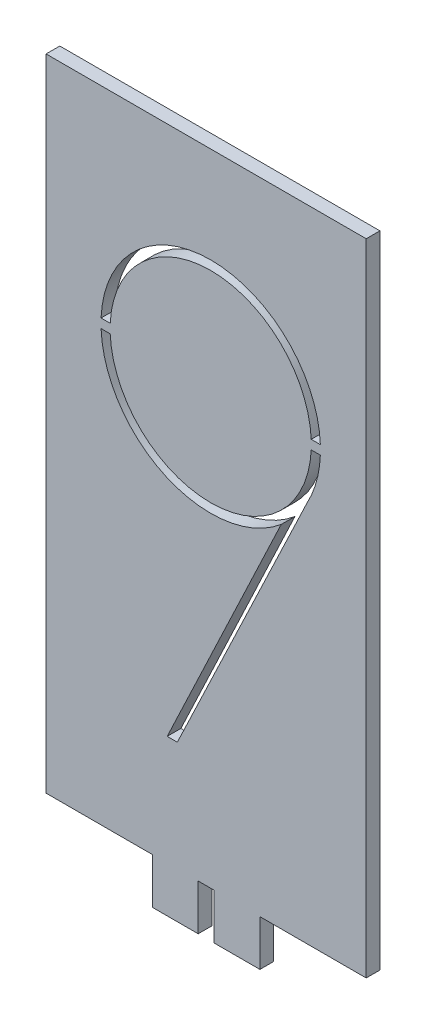
ISO-10303-21;
HEADER;
FILE_DESCRIPTION(('STEP AP214'),'2;1');
FILE_NAME('part.step','',(''),(''),'','','');
FILE_SCHEMA(('AUTOMOTIVE_DESIGN { 1 0 10303 214 1 1 1 1 }'));
ENDSEC;
DATA;
#1=APPLICATION_CONTEXT('core data for automotive mechanical design processes');
#2=APPLICATION_PROTOCOL_DEFINITION('international standard','automotive_design',2000,#1);
#3=PRODUCT_CONTEXT('',#1,'mechanical');
#4=PRODUCT('Part','Part','',(#3));
#5=PRODUCT_RELATED_PRODUCT_CATEGORY('part','',(#4));
#6=PRODUCT_DEFINITION_FORMATION('','',#4);
#7=PRODUCT_DEFINITION_CONTEXT('part definition',#1,'design');
#8=PRODUCT_DEFINITION('design','',#6,#7);
#9=PRODUCT_DEFINITION_SHAPE('','',#8);
#10=(LENGTH_UNIT() NAMED_UNIT(*) SI_UNIT(.MILLI.,.METRE.));
#11=(NAMED_UNIT(*) PLANE_ANGLE_UNIT() SI_UNIT($,.RADIAN.));
#12=(NAMED_UNIT(*) SI_UNIT($,.STERADIAN.) SOLID_ANGLE_UNIT());
#13=UNCERTAINTY_MEASURE_WITH_UNIT(LENGTH_MEASURE(1.E-05),#10,'distance_accuracy_value','');
#14=(GEOMETRIC_REPRESENTATION_CONTEXT(3) GLOBAL_UNCERTAINTY_ASSIGNED_CONTEXT((#13)) GLOBAL_UNIT_ASSIGNED_CONTEXT((#10,
#11,#12)) REPRESENTATION_CONTEXT('',''));
#15=CARTESIAN_POINT('',(0.,0.,0.));
#16=DIRECTION('',(0.,0.,1.));
#17=DIRECTION('',(1.,0.,0.));
#18=AXIS2_PLACEMENT_3D('',#15,#16,#17);
#19=CARTESIAN_POINT('',(18.,52.5,-18.5));
#20=DIRECTION('',(0.,0.,1.));
#21=DIRECTION('',(1.,0.,0.));
#22=AXIS2_PLACEMENT_3D('',#19,#20,#21);
#23=CYLINDRICAL_SURFACE('',#22,12.);
#24=CARTESIAN_POINT('',(18.,52.5,1.5));
#25=DIRECTION('',(0.,0.,1.));
#26=DIRECTION('',(1.,0.,0.));
#27=AXIS2_PLACEMENT_3D('',#24,#25,#26);
#28=CIRCLE('',#27,12.);
#29=CARTESIAN_POINT('',(6.01042119171821,52.,1.5));
#30=VERTEX_POINT('',#29);
#31=CARTESIAN_POINT('',(25.707199855607,43.3022247045423,1.5));
#32=VERTEX_POINT('',#31);
#33=EDGE_CURVE('E403',#30,#32,#28,.T.);
#34=ORIENTED_EDGE('',*,*,#33,.T.);
#35=DIRECTION('',(0.,0.,1.));
#36=VECTOR('',#35,1.);
#37=CARTESIAN_POINT('',(25.707199855607,43.3022247045423,-18.5));
#38=LINE('',#37,#36);
#39=CARTESIAN_POINT('',(25.707199855607,43.3022247045423,0.));
#40=VERTEX_POINT('',#39);
#41=EDGE_CURVE('E215',#32,#40,#38,.F.);
#42=ORIENTED_EDGE('',*,*,#41,.T.);
#43=CARTESIAN_POINT('',(18.,52.5,0.));
#44=DIRECTION('',(0.,0.,-1.));
#45=DIRECTION('',(-1.,0.,0.));
#46=AXIS2_PLACEMENT_3D('',#43,#44,#45);
#47=CIRCLE('',#46,12.);
#48=CARTESIAN_POINT('',(6.01042119171821,52.,0.));
#49=VERTEX_POINT('',#48);
#50=EDGE_CURVE('E274',#40,#49,#47,.T.);
#51=ORIENTED_EDGE('',*,*,#50,.T.);
#52=DIRECTION('',(0.,0.,1.));
#53=VECTOR('',#52,1.);
#54=CARTESIAN_POINT('',(6.01042119171821,52.,-18.5));
#55=LINE('',#54,#53);
#56=EDGE_CURVE('E402',#49,#30,#55,.T.);
#57=ORIENTED_EDGE('',*,*,#56,.T.);
#58=EDGE_LOOP('',(#34,#42,#51,#57));
#59=FACE_BOUND('',#58,.T.);
#60=ADVANCED_FACE('F39',(#59),#23,.F.);
#61=CARTESIAN_POINT('',(4.78723054685726,53.,0.));
#62=DIRECTION('',(0.,1.,0.));
#63=DIRECTION('',(-1.,0.,0.));
#64=AXIS2_PLACEMENT_3D('',#61,#62,#63);
#65=PLANE('',#64);
#66=DIRECTION('',(0.,0.,1.));
#67=VECTOR('',#66,1.);
#68=CARTESIAN_POINT('',(7.01136951208205,53.,-18.5));
#69=LINE('',#68,#67);
#70=CARTESIAN_POINT('',(7.01136951208205,53.,0.));
#71=VERTEX_POINT('',#70);
#72=CARTESIAN_POINT('',(7.01136951208205,53.,1.5));
#73=VERTEX_POINT('',#72);
#74=EDGE_CURVE('E246',#71,#73,#69,.T.);
#75=ORIENTED_EDGE('',*,*,#74,.F.);
#76=DIRECTION('',(-1.,0.,0.));
#77=VECTOR('',#76,1.);
#78=CARTESIAN_POINT('',(4.78723054685726,53.,0.));
#79=LINE('',#78,#77);
#80=CARTESIAN_POINT('',(6.01042119171821,53.,0.));
#81=VERTEX_POINT('',#80);
#82=EDGE_CURVE('E254',#71,#81,#79,.T.);
#83=ORIENTED_EDGE('',*,*,#82,.T.);
#84=DIRECTION('',(0.,0.,1.));
#85=VECTOR('',#84,1.);
#86=CARTESIAN_POINT('',(6.01042119171821,53.,-18.5));
#87=LINE('',#86,#85);
#88=CARTESIAN_POINT('',(6.01042119171821,53.,1.5));
#89=VERTEX_POINT('',#88);
#90=EDGE_CURVE('E415',#89,#81,#87,.F.);
#91=ORIENTED_EDGE('',*,*,#90,.F.);
#92=DIRECTION('',(-1.,0.,0.));
#93=VECTOR('',#92,1.);
#94=CARTESIAN_POINT('',(4.78723054685726,53.,1.5));
#95=LINE('',#94,#93);
#96=EDGE_CURVE('E265',#73,#89,#95,.T.);
#97=ORIENTED_EDGE('',*,*,#96,.F.);
#98=EDGE_LOOP('',(#75,#83,#91,#97));
#99=FACE_BOUND('',#98,.T.);
#100=ADVANCED_FACE('F470',(#99),#65,.T.);
#101=CARTESIAN_POINT('',(4.78723054685726,52.,0.));
#102=DIRECTION('',(0.,-1.,0.));
#103=DIRECTION('',(0.,0.,-1.));
#104=AXIS2_PLACEMENT_3D('',#101,#102,#103);
#105=PLANE('',#104);
#106=DIRECTION('',(0.,0.,1.));
#107=VECTOR('',#106,1.);
#108=CARTESIAN_POINT('',(28.988630487918,52.,-18.5));
#109=LINE('',#108,#107);
#110=CARTESIAN_POINT('',(28.988630487918,52.,0.));
#111=VERTEX_POINT('',#110);
#112=CARTESIAN_POINT('',(28.988630487918,52.,1.5));
#113=VERTEX_POINT('',#112);
#114=EDGE_CURVE('E423',#111,#113,#109,.T.);
#115=ORIENTED_EDGE('',*,*,#114,.F.);
#116=DIRECTION('',(1.,0.,0.));
#117=VECTOR('',#116,1.);
#118=CARTESIAN_POINT('',(4.78723054685726,52.,0.));
#119=LINE('',#118,#117);
#120=CARTESIAN_POINT('',(29.9895788082818,52.,0.));
#121=VERTEX_POINT('',#120);
#122=EDGE_CURVE('E255',#111,#121,#119,.T.);
#123=ORIENTED_EDGE('',*,*,#122,.T.);
#124=DIRECTION('',(0.,0.,1.));
#125=VECTOR('',#124,1.);
#126=CARTESIAN_POINT('',(29.9895788082818,52.,-18.5));
#127=LINE('',#126,#125);
#128=CARTESIAN_POINT('',(29.9895788082818,52.,1.5));
#129=VERTEX_POINT('',#128);
#130=EDGE_CURVE('E407',#129,#121,#127,.F.);
#131=ORIENTED_EDGE('',*,*,#130,.F.);
#132=DIRECTION('',(1.,0.,0.));
#133=VECTOR('',#132,1.);
#134=CARTESIAN_POINT('',(4.78723054685726,52.,1.5));
#135=LINE('',#134,#133);
#136=EDGE_CURVE('E249',#113,#129,#135,.T.);
#137=ORIENTED_EDGE('',*,*,#136,.F.);
#138=EDGE_LOOP('',(#115,#123,#131,#137));
#139=FACE_BOUND('',#138,.T.);
#140=ADVANCED_FACE('F467',(#139),#105,.T.);
#141=CARTESIAN_POINT('',(29.9895788082818,53.,1.5));
#142=VERTEX_POINT('',#141);
#143=EDGE_CURVE('E398',#142,#89,#28,.T.);
#144=ORIENTED_EDGE('',*,*,#143,.T.);
#145=ORIENTED_EDGE('',*,*,#90,.T.);
#146=CARTESIAN_POINT('',(29.9895788082818,53.,0.));
#147=VERTEX_POINT('',#146);
#148=EDGE_CURVE('E269',#81,#147,#47,.T.);
#149=ORIENTED_EDGE('',*,*,#148,.T.);
#150=DIRECTION('',(0.,0.,1.));
#151=VECTOR('',#150,1.);
#152=CARTESIAN_POINT('',(29.9895788082818,53.,-18.5));
#153=LINE('',#152,#151);
#154=EDGE_CURVE('E411',#147,#142,#153,.T.);
#155=ORIENTED_EDGE('',*,*,#154,.T.);
#156=EDGE_LOOP('',(#144,#145,#149,#155));
#157=FACE_BOUND('',#156,.T.);
#158=ADVANCED_FACE('F469',(#157),#23,.F.);
#159=CARTESIAN_POINT('',(0.,0.,1.5));
#160=DIRECTION('',(0.,1.,0.));
#161=DIRECTION('',(0.,0.,1.));
#162=AXIS2_PLACEMENT_3D('',#159,#160,#161);
#163=PLANE('',#162);
#164=DIRECTION('',(1.,0.,0.));
#165=VECTOR('',#164,1.);
#166=CARTESIAN_POINT('',(0.,0.,1.5));
#167=LINE('',#166,#165);
#168=CARTESIAN_POINT('',(11.63,0.,1.5));
#169=VERTEX_POINT('',#168);
#170=CARTESIAN_POINT('',(16.63,0.,1.5));
#171=VERTEX_POINT('',#170);
#172=EDGE_CURVE('E312',#169,#171,#167,.T.);
#173=ORIENTED_EDGE('',*,*,#172,.F.);
#174=DIRECTION('',(0.,0.,1.));
#175=VECTOR('',#174,1.);
#176=CARTESIAN_POINT('',(11.63,0.,0.));
#177=LINE('',#176,#175);
#178=CARTESIAN_POINT('',(11.63,0.,0.));
#179=VERTEX_POINT('',#178);
#180=EDGE_CURVE('E377',#179,#169,#177,.T.);
#181=ORIENTED_EDGE('',*,*,#180,.F.);
#182=DIRECTION('',(1.,0.,0.));
#183=VECTOR('',#182,1.);
#184=CARTESIAN_POINT('',(0.,0.,0.));
#185=LINE('',#184,#183);
#186=CARTESIAN_POINT('',(16.63,0.,0.));
#187=VERTEX_POINT('',#186);
#188=EDGE_CURVE('E260',#179,#187,#185,.T.);
#189=ORIENTED_EDGE('',*,*,#188,.T.);
#190=DIRECTION('',(0.,0.,1.));
#191=VECTOR('',#190,1.);
#192=CARTESIAN_POINT('',(16.63,0.,0.));
#193=LINE('',#192,#191);
#194=EDGE_CURVE('E300',#187,#171,#193,.T.);
#195=ORIENTED_EDGE('',*,*,#194,.T.);
#196=EDGE_LOOP('',(#173,#181,#189,#195));
#197=FACE_BOUND('',#196,.T.);
#198=ADVANCED_FACE('F476',(#197),#163,.F.);
#199=CARTESIAN_POINT('',(0.,0.,1.5));
#200=DIRECTION('',(1.,0.,0.));
#201=DIRECTION('',(0.,1.,0.));
#202=AXIS2_PLACEMENT_3D('',#199,#200,#201);
#203=PLANE('',#202);
#204=DIRECTION('',(0.,-1.,0.));
#205=VECTOR('',#204,1.);
#206=CARTESIAN_POINT('',(0.,0.,0.));
#207=LINE('',#206,#205);
#208=CARTESIAN_POINT('',(0.,75.,0.));
#209=VERTEX_POINT('',#208);
#210=CARTESIAN_POINT('',(0.,5.,0.));
#211=VERTEX_POINT('',#210);
#212=EDGE_CURVE('E296',#209,#211,#207,.T.);
#213=ORIENTED_EDGE('',*,*,#212,.T.);
#214=DIRECTION('',(0.,0.,1.));
#215=VECTOR('',#214,1.);
#216=CARTESIAN_POINT('',(0.,5.,0.));
#217=LINE('',#216,#215);
#218=CARTESIAN_POINT('',(0.,5.,1.5));
#219=VERTEX_POINT('',#218);
#220=EDGE_CURVE('E286',#211,#219,#217,.T.);
#221=ORIENTED_EDGE('',*,*,#220,.T.);
#222=DIRECTION('',(0.,-1.,0.));
#223=VECTOR('',#222,1.);
#224=CARTESIAN_POINT('',(0.,0.,1.5));
#225=LINE('',#224,#223);
#226=CARTESIAN_POINT('',(0.,75.,1.5));
#227=VERTEX_POINT('',#226);
#228=EDGE_CURVE('E279',#227,#219,#225,.T.);
#229=ORIENTED_EDGE('',*,*,#228,.F.);
#230=DIRECTION('',(0.,0.,-1.));
#231=VECTOR('',#230,1.);
#232=CARTESIAN_POINT('',(0.,75.,1.5));
#233=LINE('',#232,#231);
#234=EDGE_CURVE('E281',#227,#209,#233,.T.);
#235=ORIENTED_EDGE('',*,*,#234,.T.);
#236=EDGE_LOOP('',(#213,#221,#229,#235));
#237=FACE_BOUND('',#236,.T.);
#238=ADVANCED_FACE('F533',(#237),#203,.F.);
#239=CARTESIAN_POINT('',(18.38,0.,0.));
#240=VERTEX_POINT('',#239);
#241=CARTESIAN_POINT('',(23.38,0.,0.));
#242=VERTEX_POINT('',#241);
#243=EDGE_CURVE('E285',#240,#242,#185,.T.);
#244=ORIENTED_EDGE('',*,*,#243,.T.);
#245=DIRECTION('',(0.,0.,1.));
#246=VECTOR('',#245,1.);
#247=CARTESIAN_POINT('',(23.38,0.,0.));
#248=LINE('',#247,#246);
#249=CARTESIAN_POINT('',(23.38,0.,1.5));
#250=VERTEX_POINT('',#249);
#251=EDGE_CURVE('E292',#242,#250,#248,.T.);
#252=ORIENTED_EDGE('',*,*,#251,.T.);
#253=CARTESIAN_POINT('',(18.38,0.,1.5));
#254=VERTEX_POINT('',#253);
#255=EDGE_CURVE('E308',#254,#250,#167,.T.);
#256=ORIENTED_EDGE('',*,*,#255,.F.);
#257=DIRECTION('',(0.,0.,1.));
#258=VECTOR('',#257,1.);
#259=CARTESIAN_POINT('',(18.38,0.,0.));
#260=LINE('',#259,#258);
#261=EDGE_CURVE('E319',#240,#254,#260,.T.);
#262=ORIENTED_EDGE('',*,*,#261,.F.);
#263=EDGE_LOOP('',(#244,#252,#256,#262));
#264=FACE_BOUND('',#263,.T.);
#265=ADVANCED_FACE('F530',(#264),#163,.F.);
#266=CARTESIAN_POINT('',(35.,0.,1.5));
#267=DIRECTION('',(-1.,0.,0.));
#268=DIRECTION('',(0.,-1.,0.));
#269=AXIS2_PLACEMENT_3D('',#266,#267,#268);
#270=PLANE('',#269);
#271=DIRECTION('',(0.,1.,0.));
#272=VECTOR('',#271,1.);
#273=CARTESIAN_POINT('',(35.,0.,1.5));
#274=LINE('',#273,#272);
#275=CARTESIAN_POINT('',(35.,5.,1.5));
#276=VERTEX_POINT('',#275);
#277=CARTESIAN_POINT('',(35.,75.,1.5));
#278=VERTEX_POINT('',#277);
#279=EDGE_CURVE('E305',#276,#278,#274,.T.);
#280=ORIENTED_EDGE('',*,*,#279,.F.);
#281=DIRECTION('',(0.,0.,1.));
#282=VECTOR('',#281,1.);
#283=CARTESIAN_POINT('',(35.,5.,0.));
#284=LINE('',#283,#282);
#285=CARTESIAN_POINT('',(35.,5.,0.));
#286=VERTEX_POINT('',#285);
#287=EDGE_CURVE('E357',#286,#276,#284,.T.);
#288=ORIENTED_EDGE('',*,*,#287,.F.);
#289=DIRECTION('',(0.,1.,0.));
#290=VECTOR('',#289,1.);
#291=CARTESIAN_POINT('',(35.,0.,0.));
#292=LINE('',#291,#290);
#293=CARTESIAN_POINT('',(35.,75.,0.));
#294=VERTEX_POINT('',#293);
#295=EDGE_CURVE('E289',#286,#294,#292,.T.);
#296=ORIENTED_EDGE('',*,*,#295,.T.);
#297=DIRECTION('',(0.,0.,-1.));
#298=VECTOR('',#297,1.);
#299=CARTESIAN_POINT('',(35.,75.,1.5));
#300=LINE('',#299,#298);
#301=EDGE_CURVE('E275',#278,#294,#300,.T.);
#302=ORIENTED_EDGE('',*,*,#301,.F.);
#303=EDGE_LOOP('',(#280,#288,#296,#302));
#304=FACE_BOUND('',#303,.T.);
#305=ADVANCED_FACE('F526',(#304),#270,.F.);
#306=CARTESIAN_POINT('',(0.,75.,1.5));
#307=DIRECTION('',(0.,-1.,0.));
#308=DIRECTION('',(0.,0.,-1.));
#309=AXIS2_PLACEMENT_3D('',#306,#307,#308);
#310=PLANE('',#309);
#311=DIRECTION('',(-1.,0.,0.));
#312=VECTOR('',#311,1.);
#313=CARTESIAN_POINT('',(0.,75.,0.));
#314=LINE('',#313,#312);
#315=EDGE_CURVE('E280',#294,#209,#314,.T.);
#316=ORIENTED_EDGE('',*,*,#315,.T.);
#317=ORIENTED_EDGE('',*,*,#234,.F.);
#318=DIRECTION('',(-1.,0.,0.));
#319=VECTOR('',#318,1.);
#320=CARTESIAN_POINT('',(0.,75.,1.5));
#321=LINE('',#320,#319);
#322=EDGE_CURVE('E301',#278,#227,#321,.T.);
#323=ORIENTED_EDGE('',*,*,#322,.F.);
#324=ORIENTED_EDGE('',*,*,#301,.T.);
#325=EDGE_LOOP('',(#316,#317,#323,#324));
#326=FACE_BOUND('',#325,.T.);
#327=ADVANCED_FACE('F523',(#326),#310,.F.);
#328=CARTESIAN_POINT('',(0.,0.,1.5));
#329=DIRECTION('',(0.,0.,-1.));
#330=DIRECTION('',(-1.,0.,0.));
#331=AXIS2_PLACEMENT_3D('',#328,#329,#330);
#332=PLANE('',#331);
#333=CARTESIAN_POINT('',(28.5323451419619,46.7493734419115,1.5));
#334=VERTEX_POINT('',#333);
#335=EDGE_CURVE('E272',#334,#129,#28,.T.);
#336=ORIENTED_EDGE('',*,*,#335,.F.);
#337=DIRECTION('',(0.430383211531517,0.902646271377563,0.));
#338=VECTOR('',#337,1.);
#339=CARTESIAN_POINT('',(14.3477954584627,17.,1.5));
#340=LINE('',#339,#338);
#341=CARTESIAN_POINT('',(14.3477954584627,17.,1.5));
#342=VERTEX_POINT('',#341);
#343=EDGE_CURVE('E210',#342,#334,#340,.T.);
#344=ORIENTED_EDGE('',*,*,#343,.F.);
#345=DIRECTION('',(1.,0.,0.));
#346=VECTOR('',#345,1.);
#347=CARTESIAN_POINT('',(14.3477954584627,17.,1.5));
#348=LINE('',#347,#346);
#349=CARTESIAN_POINT('',(13.2411645080588,17.,1.5));
#350=VERTEX_POINT('',#349);
#351=EDGE_CURVE('E205',#350,#342,#348,.T.);
#352=ORIENTED_EDGE('',*,*,#351,.F.);
#353=DIRECTION('',(-0.428285190978033,-0.903643621782896,0.));
#354=VECTOR('',#353,1.);
#355=CARTESIAN_POINT('',(13.2411645080588,17.,1.5));
#356=LINE('',#355,#354);
#357=EDGE_CURVE('E213',#32,#350,#356,.T.);
#358=ORIENTED_EDGE('',*,*,#357,.F.);
#359=ORIENTED_EDGE('',*,*,#33,.F.);
#360=CARTESIAN_POINT('',(7.01136951208205,52.,1.5));
#361=VERTEX_POINT('',#360);
#362=EDGE_CURVE('E261',#30,#361,#135,.T.);
#363=ORIENTED_EDGE('',*,*,#362,.T.);
#364=CARTESIAN_POINT('',(18.,52.5,1.5));
#365=DIRECTION('',(0.,0.,1.));
#366=DIRECTION('',(1.,0.,0.));
#367=AXIS2_PLACEMENT_3D('',#364,#365,#366);
#368=CIRCLE('',#367,11.);
#369=EDGE_CURVE('E235',#361,#113,#368,.T.);
#370=ORIENTED_EDGE('',*,*,#369,.T.);
#371=ORIENTED_EDGE('',*,*,#136,.T.);
#372=EDGE_LOOP('',(#336,#344,#352,#358,#359,#363,#370,#371));
#373=FACE_BOUND('',#372,.T.);
#374=CARTESIAN_POINT('',(28.988630487918,53.,1.5));
#375=VERTEX_POINT('',#374);
#376=EDGE_CURVE('E266',#142,#375,#95,.T.);
#377=ORIENTED_EDGE('',*,*,#376,.T.);
#378=EDGE_CURVE('E63',#375,#73,#368,.T.);
#379=ORIENTED_EDGE('',*,*,#378,.T.);
#380=ORIENTED_EDGE('',*,*,#96,.T.);
#381=ORIENTED_EDGE('',*,*,#143,.F.);
#382=EDGE_LOOP('',(#377,#379,#380,#381));
#383=FACE_BOUND('',#382,.T.);
#384=ORIENTED_EDGE('',*,*,#228,.T.);
#385=DIRECTION('',(-1.,0.,0.));
#386=VECTOR('',#385,1.);
#387=CARTESIAN_POINT('',(0.,5.,1.5));
#388=LINE('',#387,#386);
#389=CARTESIAN_POINT('',(11.63,5.,1.5));
#390=VERTEX_POINT('',#389);
#391=EDGE_CURVE('E360',#390,#219,#388,.T.);
#392=ORIENTED_EDGE('',*,*,#391,.F.);
#393=DIRECTION('',(0.,1.,0.));
#394=VECTOR('',#393,1.);
#395=CARTESIAN_POINT('',(11.63,0.,1.5));
#396=LINE('',#395,#394);
#397=EDGE_CURVE('E380',#169,#390,#396,.T.);
#398=ORIENTED_EDGE('',*,*,#397,.F.);
#399=ORIENTED_EDGE('',*,*,#172,.T.);
#400=DIRECTION('',(0.,-1.,0.));
#401=VECTOR('',#400,1.);
#402=CARTESIAN_POINT('',(16.63,0.,1.5));
#403=LINE('',#402,#401);
#404=CARTESIAN_POINT('',(16.63,5.,1.5));
#405=VERTEX_POINT('',#404);
#406=EDGE_CURVE('E331',#405,#171,#403,.T.);
#407=ORIENTED_EDGE('',*,*,#406,.F.);
#408=DIRECTION('',(-1.,0.,0.));
#409=VECTOR('',#408,1.);
#410=CARTESIAN_POINT('',(16.63,5.,1.5));
#411=LINE('',#410,#409);
#412=CARTESIAN_POINT('',(18.38,5.,1.5));
#413=VERTEX_POINT('',#412);
#414=EDGE_CURVE('E327',#413,#405,#411,.T.);
#415=ORIENTED_EDGE('',*,*,#414,.F.);
#416=DIRECTION('',(0.,1.,0.));
#417=VECTOR('',#416,1.);
#418=CARTESIAN_POINT('',(18.38,0.,1.5));
#419=LINE('',#418,#417);
#420=EDGE_CURVE('E323',#254,#413,#419,.T.);
#421=ORIENTED_EDGE('',*,*,#420,.F.);
#422=ORIENTED_EDGE('',*,*,#255,.T.);
#423=DIRECTION('',(0.,-1.,0.));
#424=VECTOR('',#423,1.);
#425=CARTESIAN_POINT('',(23.38,5.,1.5));
#426=LINE('',#425,#424);
#427=CARTESIAN_POINT('',(23.38,5.,1.5));
#428=VERTEX_POINT('',#427);
#429=EDGE_CURVE('E322',#428,#250,#426,.T.);
#430=ORIENTED_EDGE('',*,*,#429,.F.);
#431=DIRECTION('',(-1.,0.,0.));
#432=VECTOR('',#431,1.);
#433=CARTESIAN_POINT('',(23.38,5.,1.5));
#434=LINE('',#433,#432);
#435=EDGE_CURVE('E361',#276,#428,#434,.T.);
#436=ORIENTED_EDGE('',*,*,#435,.F.);
#437=ORIENTED_EDGE('',*,*,#279,.T.);
#438=ORIENTED_EDGE('',*,*,#322,.T.);
#439=EDGE_LOOP('',(#384,#392,#398,#399,#407,#415,#421,#422,#430,#436,#437,#438));
#440=FACE_BOUND('',#439,.T.);
#441=ADVANCED_FACE('F41',(#373,#383,#440),#332,.F.);
#442=CARTESIAN_POINT('',(0.,0.,0.));
#443=DIRECTION('',(0.,0.,-1.));
#444=DIRECTION('',(-1.,0.,0.));
#445=AXIS2_PLACEMENT_3D('',#442,#443,#444);
#446=PLANE('',#445);
#447=DIRECTION('',(-0.430383211531517,-0.902646271377563,0.));
#448=VECTOR('',#447,1.);
#449=CARTESIAN_POINT('',(5.08593286463498,-2.42498106880199,0.));
#450=LINE('',#449,#448);
#451=CARTESIAN_POINT('',(28.5323451419619,46.7493734419115,0.));
#452=VERTEX_POINT('',#451);
#453=CARTESIAN_POINT('',(14.3477954584627,17.,0.));
#454=VERTEX_POINT('',#453);
#455=EDGE_CURVE('E232',#452,#454,#450,.T.);
#456=ORIENTED_EDGE('',*,*,#455,.F.);
#457=EDGE_CURVE('E273',#121,#452,#47,.T.);
#458=ORIENTED_EDGE('',*,*,#457,.F.);
#459=ORIENTED_EDGE('',*,*,#122,.F.);
#460=CARTESIAN_POINT('',(18.,52.5,0.));
#461=DIRECTION('',(0.,0.,-1.));
#462=DIRECTION('',(-1.,0.,0.));
#463=AXIS2_PLACEMENT_3D('',#460,#461,#462);
#464=CIRCLE('',#463,11.);
#465=CARTESIAN_POINT('',(7.01136951208205,52.,0.));
#466=VERTEX_POINT('',#465);
#467=EDGE_CURVE('E238',#111,#466,#464,.T.);
#468=ORIENTED_EDGE('',*,*,#467,.T.);
#469=EDGE_CURVE('E250',#49,#466,#119,.T.);
#470=ORIENTED_EDGE('',*,*,#469,.F.);
#471=ORIENTED_EDGE('',*,*,#50,.F.);
#472=DIRECTION('',(0.428285190978033,0.903643621782896,0.));
#473=VECTOR('',#472,1.);
#474=CARTESIAN_POINT('',(4.233069393504,-2.00627868101713,0.));
#475=LINE('',#474,#473);
#476=CARTESIAN_POINT('',(13.2411645080588,17.,0.));
#477=VERTEX_POINT('',#476);
#478=EDGE_CURVE('E55',#477,#40,#475,.T.);
#479=ORIENTED_EDGE('',*,*,#478,.F.);
#480=DIRECTION('',(-1.,0.,0.));
#481=VECTOR('',#480,1.);
#482=CARTESIAN_POINT('',(0.,17.,0.));
#483=LINE('',#482,#481);
#484=EDGE_CURVE('E11',#454,#477,#483,.T.);
#485=ORIENTED_EDGE('',*,*,#484,.F.);
#486=EDGE_LOOP('',(#456,#458,#459,#468,#470,#471,#479,#485));
#487=FACE_BOUND('',#486,.T.);
#488=CARTESIAN_POINT('',(28.988630487918,53.,0.));
#489=VERTEX_POINT('',#488);
#490=EDGE_CURVE('E239',#71,#489,#464,.T.);
#491=ORIENTED_EDGE('',*,*,#490,.T.);
#492=EDGE_CURVE('E256',#147,#489,#79,.T.);
#493=ORIENTED_EDGE('',*,*,#492,.F.);
#494=ORIENTED_EDGE('',*,*,#148,.F.);
#495=ORIENTED_EDGE('',*,*,#82,.F.);
#496=EDGE_LOOP('',(#491,#493,#494,#495));
#497=FACE_BOUND('',#496,.T.);
#498=DIRECTION('',(-1.,0.,0.));
#499=VECTOR('',#498,1.);
#500=CARTESIAN_POINT('',(0.,5.,0.));
#501=LINE('',#500,#499);
#502=CARTESIAN_POINT('',(11.63,5.,0.));
#503=VERTEX_POINT('',#502);
#504=EDGE_CURVE('E304',#503,#211,#501,.T.);
#505=ORIENTED_EDGE('',*,*,#504,.T.);
#506=ORIENTED_EDGE('',*,*,#212,.F.);
#507=ORIENTED_EDGE('',*,*,#315,.F.);
#508=ORIENTED_EDGE('',*,*,#295,.F.);
#509=DIRECTION('',(-1.,0.,0.));
#510=VECTOR('',#509,1.);
#511=CARTESIAN_POINT('',(23.38,5.,0.));
#512=LINE('',#511,#510);
#513=CARTESIAN_POINT('',(23.38,5.,0.));
#514=VERTEX_POINT('',#513);
#515=EDGE_CURVE('E370',#286,#514,#512,.T.);
#516=ORIENTED_EDGE('',*,*,#515,.T.);
#517=DIRECTION('',(0.,-1.,0.));
#518=VECTOR('',#517,1.);
#519=CARTESIAN_POINT('',(23.38,5.,0.));
#520=LINE('',#519,#518);
#521=EDGE_CURVE('E350',#514,#242,#520,.T.);
#522=ORIENTED_EDGE('',*,*,#521,.T.);
#523=ORIENTED_EDGE('',*,*,#243,.F.);
#524=DIRECTION('',(0.,1.,0.));
#525=VECTOR('',#524,1.);
#526=CARTESIAN_POINT('',(18.38,0.,0.));
#527=LINE('',#526,#525);
#528=CARTESIAN_POINT('',(18.38,5.,0.));
#529=VERTEX_POINT('',#528);
#530=EDGE_CURVE('E346',#240,#529,#527,.T.);
#531=ORIENTED_EDGE('',*,*,#530,.T.);
#532=DIRECTION('',(-1.,0.,0.));
#533=VECTOR('',#532,1.);
#534=CARTESIAN_POINT('',(16.63,5.,0.));
#535=LINE('',#534,#533);
#536=CARTESIAN_POINT('',(16.63,5.,0.));
#537=VERTEX_POINT('',#536);
#538=EDGE_CURVE('E341',#529,#537,#535,.T.);
#539=ORIENTED_EDGE('',*,*,#538,.T.);
#540=DIRECTION('',(0.,-1.,0.));
#541=VECTOR('',#540,1.);
#542=CARTESIAN_POINT('',(16.63,0.,0.));
#543=LINE('',#542,#541);
#544=EDGE_CURVE('E345',#537,#187,#543,.T.);
#545=ORIENTED_EDGE('',*,*,#544,.T.);
#546=ORIENTED_EDGE('',*,*,#188,.F.);
#547=DIRECTION('',(0.,1.,0.));
#548=VECTOR('',#547,1.);
#549=CARTESIAN_POINT('',(11.63,0.,0.));
#550=LINE('',#549,#548);
#551=EDGE_CURVE('E340',#179,#503,#550,.T.);
#552=ORIENTED_EDGE('',*,*,#551,.T.);
#553=EDGE_LOOP('',(#505,#506,#507,#508,#516,#522,#523,#531,#539,#545,#546,#552));
#554=FACE_BOUND('',#553,.T.);
#555=ADVANCED_FACE('F463',(#487,#497,#554),#446,.T.);
#556=CARTESIAN_POINT('',(16.63,0.,0.));
#557=DIRECTION('',(-1.,0.,0.));
#558=DIRECTION('',(0.,0.,1.));
#559=AXIS2_PLACEMENT_3D('',#556,#557,#558);
#560=PLANE('',#559);
#561=ORIENTED_EDGE('',*,*,#406,.T.);
#562=ORIENTED_EDGE('',*,*,#194,.F.);
#563=ORIENTED_EDGE('',*,*,#544,.F.);
#564=DIRECTION('',(0.,0.,1.));
#565=VECTOR('',#564,1.);
#566=CARTESIAN_POINT('',(16.63,5.,0.));
#567=LINE('',#566,#565);
#568=EDGE_CURVE('E328',#537,#405,#567,.T.);
#569=ORIENTED_EDGE('',*,*,#568,.T.);
#570=EDGE_LOOP('',(#561,#562,#563,#569));
#571=FACE_BOUND('',#570,.T.);
#572=ADVANCED_FACE('F515',(#571),#560,.F.);
#573=CARTESIAN_POINT('',(16.63,5.,0.));
#574=DIRECTION('',(0.,1.,0.));
#575=DIRECTION('',(0.,0.,1.));
#576=AXIS2_PLACEMENT_3D('',#573,#574,#575);
#577=PLANE('',#576);
#578=ORIENTED_EDGE('',*,*,#414,.T.);
#579=ORIENTED_EDGE('',*,*,#568,.F.);
#580=ORIENTED_EDGE('',*,*,#538,.F.);
#581=DIRECTION('',(0.,0.,1.));
#582=VECTOR('',#581,1.);
#583=CARTESIAN_POINT('',(18.38,5.,0.));
#584=LINE('',#583,#582);
#585=EDGE_CURVE('E324',#529,#413,#584,.T.);
#586=ORIENTED_EDGE('',*,*,#585,.T.);
#587=EDGE_LOOP('',(#578,#579,#580,#586));
#588=FACE_BOUND('',#587,.T.);
#589=ADVANCED_FACE('F512',(#588),#577,.F.);
#590=CARTESIAN_POINT('',(18.38,0.,0.));
#591=DIRECTION('',(1.,0.,0.));
#592=DIRECTION('',(0.,0.,-1.));
#593=AXIS2_PLACEMENT_3D('',#590,#591,#592);
#594=PLANE('',#593);
#595=ORIENTED_EDGE('',*,*,#420,.T.);
#596=ORIENTED_EDGE('',*,*,#585,.F.);
#597=ORIENTED_EDGE('',*,*,#530,.F.);
#598=ORIENTED_EDGE('',*,*,#261,.T.);
#599=EDGE_LOOP('',(#595,#596,#597,#598));
#600=FACE_BOUND('',#599,.T.);
#601=ADVANCED_FACE('F510',(#600),#594,.F.);
#602=CARTESIAN_POINT('',(23.38,5.,0.));
#603=DIRECTION('',(-1.,0.,0.));
#604=DIRECTION('',(0.,0.,1.));
#605=AXIS2_PLACEMENT_3D('',#602,#603,#604);
#606=PLANE('',#605);
#607=ORIENTED_EDGE('',*,*,#429,.T.);
#608=ORIENTED_EDGE('',*,*,#251,.F.);
#609=ORIENTED_EDGE('',*,*,#521,.F.);
#610=DIRECTION('',(0.,0.,1.));
#611=VECTOR('',#610,1.);
#612=CARTESIAN_POINT('',(23.38,5.,0.));
#613=LINE('',#612,#611);
#614=EDGE_CURVE('E362',#514,#428,#613,.T.);
#615=ORIENTED_EDGE('',*,*,#614,.T.);
#616=EDGE_LOOP('',(#607,#608,#609,#615));
#617=FACE_BOUND('',#616,.T.);
#618=ADVANCED_FACE('F506',(#617),#606,.F.);
#619=CARTESIAN_POINT('',(23.38,5.,0.));
#620=DIRECTION('',(0.,1.,0.));
#621=DIRECTION('',(0.,0.,1.));
#622=AXIS2_PLACEMENT_3D('',#619,#620,#621);
#623=PLANE('',#622);
#624=ORIENTED_EDGE('',*,*,#435,.T.);
#625=ORIENTED_EDGE('',*,*,#614,.F.);
#626=ORIENTED_EDGE('',*,*,#515,.F.);
#627=ORIENTED_EDGE('',*,*,#287,.T.);
#628=EDGE_LOOP('',(#624,#625,#626,#627));
#629=FACE_BOUND('',#628,.T.);
#630=ADVANCED_FACE('F501',(#629),#623,.F.);
#631=CARTESIAN_POINT('',(0.,5.,0.));
#632=DIRECTION('',(0.,1.,0.));
#633=DIRECTION('',(0.,0.,1.));
#634=AXIS2_PLACEMENT_3D('',#631,#632,#633);
#635=PLANE('',#634);
#636=ORIENTED_EDGE('',*,*,#391,.T.);
#637=ORIENTED_EDGE('',*,*,#220,.F.);
#638=ORIENTED_EDGE('',*,*,#504,.F.);
#639=DIRECTION('',(0.,0.,1.));
#640=VECTOR('',#639,1.);
#641=CARTESIAN_POINT('',(11.63,5.,0.));
#642=LINE('',#641,#640);
#643=EDGE_CURVE('E381',#503,#390,#642,.T.);
#644=ORIENTED_EDGE('',*,*,#643,.T.);
#645=EDGE_LOOP('',(#636,#637,#638,#644));
#646=FACE_BOUND('',#645,.T.);
#647=ADVANCED_FACE('F495',(#646),#635,.F.);
#648=CARTESIAN_POINT('',(11.63,0.,0.));
#649=DIRECTION('',(1.,0.,0.));
#650=DIRECTION('',(0.,1.,0.));
#651=AXIS2_PLACEMENT_3D('',#648,#649,#650);
#652=PLANE('',#651);
#653=ORIENTED_EDGE('',*,*,#397,.T.);
#654=ORIENTED_EDGE('',*,*,#643,.F.);
#655=ORIENTED_EDGE('',*,*,#551,.F.);
#656=ORIENTED_EDGE('',*,*,#180,.T.);
#657=EDGE_LOOP('',(#653,#654,#655,#656));
#658=FACE_BOUND('',#657,.T.);
#659=ADVANCED_FACE('F489',(#658),#652,.F.);
#660=ORIENTED_EDGE('',*,*,#457,.T.);
#661=DIRECTION('',(0.,0.,1.));
#662=VECTOR('',#661,1.);
#663=CARTESIAN_POINT('',(28.5323451419618,46.7493734419114,-18.5));
#664=LINE('',#663,#662);
#665=EDGE_CURVE('E48',#452,#334,#664,.T.);
#666=ORIENTED_EDGE('',*,*,#665,.T.);
#667=ORIENTED_EDGE('',*,*,#335,.T.);
#668=ORIENTED_EDGE('',*,*,#130,.T.);
#669=EDGE_LOOP('',(#660,#666,#667,#668));
#670=FACE_BOUND('',#669,.T.);
#671=ADVANCED_FACE('F430',(#670),#23,.F.);
#672=DIRECTION('',(0.,0.,1.));
#673=VECTOR('',#672,1.);
#674=CARTESIAN_POINT('',(28.988630487918,53.,-18.5));
#675=LINE('',#674,#673);
#676=EDGE_CURVE('E243',#375,#489,#675,.F.);
#677=ORIENTED_EDGE('',*,*,#676,.F.);
#678=ORIENTED_EDGE('',*,*,#376,.F.);
#679=ORIENTED_EDGE('',*,*,#154,.F.);
#680=ORIENTED_EDGE('',*,*,#492,.T.);
#681=EDGE_LOOP('',(#677,#678,#679,#680));
#682=FACE_BOUND('',#681,.T.);
#683=ADVANCED_FACE('F481',(#682),#65,.T.);
#684=DIRECTION('',(0.,0.,1.));
#685=VECTOR('',#684,1.);
#686=CARTESIAN_POINT('',(7.01136951208205,52.,-18.5));
#687=LINE('',#686,#685);
#688=EDGE_CURVE('E419',#361,#466,#687,.F.);
#689=ORIENTED_EDGE('',*,*,#688,.F.);
#690=ORIENTED_EDGE('',*,*,#362,.F.);
#691=ORIENTED_EDGE('',*,*,#56,.F.);
#692=ORIENTED_EDGE('',*,*,#469,.T.);
#693=EDGE_LOOP('',(#689,#690,#691,#692));
#694=FACE_BOUND('',#693,.T.);
#695=ADVANCED_FACE('F445',(#694),#105,.T.);
#696=CARTESIAN_POINT('',(18.,52.5,-18.5));
#697=DIRECTION('',(0.,0.,1.));
#698=DIRECTION('',(1.,0.,0.));
#699=AXIS2_PLACEMENT_3D('',#696,#697,#698);
#700=CYLINDRICAL_SURFACE('',#699,11.);
#701=ORIENTED_EDGE('',*,*,#114,.T.);
#702=ORIENTED_EDGE('',*,*,#369,.F.);
#703=ORIENTED_EDGE('',*,*,#688,.T.);
#704=ORIENTED_EDGE('',*,*,#467,.F.);
#705=EDGE_LOOP('',(#701,#702,#703,#704));
#706=FACE_BOUND('',#705,.T.);
#707=ADVANCED_FACE('F448',(#706),#700,.T.);
#708=ORIENTED_EDGE('',*,*,#490,.F.);
#709=ORIENTED_EDGE('',*,*,#74,.T.);
#710=ORIENTED_EDGE('',*,*,#378,.F.);
#711=ORIENTED_EDGE('',*,*,#676,.T.);
#712=EDGE_LOOP('',(#708,#709,#710,#711));
#713=FACE_BOUND('',#712,.T.);
#714=ADVANCED_FACE('F643',(#713),#700,.T.);
#715=CARTESIAN_POINT('',(14.3477954584627,17.,-18.5));
#716=DIRECTION('',(0.902646271377563,-0.430383211531517,0.));
#717=DIRECTION('',(0.430383211531517,0.902646271377563,0.));
#718=AXIS2_PLACEMENT_3D('',#715,#716,#717);
#719=PLANE('',#718);
#720=ORIENTED_EDGE('',*,*,#455,.T.);
#721=DIRECTION('',(0.,0.,1.));
#722=VECTOR('',#721,1.);
#723=CARTESIAN_POINT('',(14.3477954584627,17.,-18.5));
#724=LINE('',#723,#722);
#725=EDGE_CURVE('E209',#454,#342,#724,.T.);
#726=ORIENTED_EDGE('',*,*,#725,.T.);
#727=ORIENTED_EDGE('',*,*,#343,.T.);
#728=ORIENTED_EDGE('',*,*,#665,.F.);
#729=EDGE_LOOP('',(#720,#726,#727,#728));
#730=FACE_BOUND('',#729,.T.);
#731=ADVANCED_FACE('F646',(#730),#719,.F.);
#732=CARTESIAN_POINT('',(14.3477954584627,17.,-18.5));
#733=DIRECTION('',(0.,-1.,0.));
#734=DIRECTION('',(0.,0.,-1.));
#735=AXIS2_PLACEMENT_3D('',#732,#733,#734);
#736=PLANE('',#735);
#737=ORIENTED_EDGE('',*,*,#484,.T.);
#738=DIRECTION('',(0.,0.,1.));
#739=VECTOR('',#738,1.);
#740=CARTESIAN_POINT('',(13.2411645080588,17.,-18.5));
#741=LINE('',#740,#739);
#742=EDGE_CURVE('E200',#477,#350,#741,.T.);
#743=ORIENTED_EDGE('',*,*,#742,.T.);
#744=ORIENTED_EDGE('',*,*,#351,.T.);
#745=ORIENTED_EDGE('',*,*,#725,.F.);
#746=EDGE_LOOP('',(#737,#743,#744,#745));
#747=FACE_BOUND('',#746,.T.);
#748=ADVANCED_FACE('F202',(#747),#736,.F.);
#749=CARTESIAN_POINT('',(13.2411645080588,17.,-18.5));
#750=DIRECTION('',(-0.903643621782896,0.428285190978033,0.));
#751=DIRECTION('',(-0.428285190978033,-0.903643621782896,0.));
#752=AXIS2_PLACEMENT_3D('',#749,#750,#751);
#753=PLANE('',#752);
#754=ORIENTED_EDGE('',*,*,#478,.T.);
#755=ORIENTED_EDGE('',*,*,#41,.F.);
#756=ORIENTED_EDGE('',*,*,#357,.T.);
#757=ORIENTED_EDGE('',*,*,#742,.F.);
#758=EDGE_LOOP('',(#754,#755,#756,#757));
#759=FACE_BOUND('',#758,.T.);
#760=ADVANCED_FACE('F214',(#759),#753,.F.);
#761=CLOSED_SHELL('',(#60,#100,#140,#158,#198,#238,#265,#305,#327,#441,#555,#572,#589,#601,#618,
#630,#647,#659,#671,#683,#695,#707,#714,#731,#748,#760));
#762=MANIFOLD_SOLID_BREP('B2',#761);
#763=ADVANCED_BREP_SHAPE_REPRESENTATION('',(#18,#762),#14);
#764=SHAPE_DEFINITION_REPRESENTATION(#9,#763);
ENDSEC;
END-ISO-10303-21;
